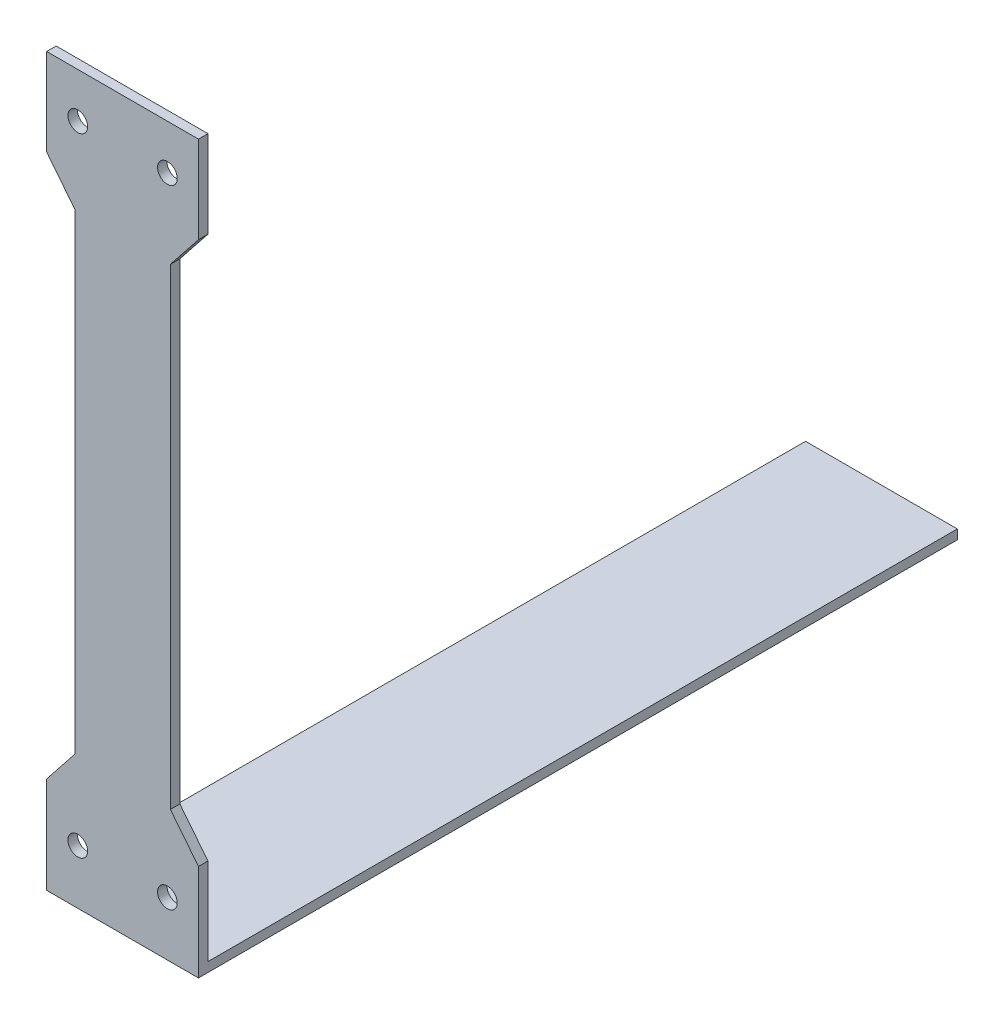
ISO-10303-21;
HEADER;
FILE_DESCRIPTION(('STEP AP214'),'2;1');
FILE_NAME('part.step','',(''),(''),'','','');
FILE_SCHEMA(('AUTOMOTIVE_DESIGN { 1 0 10303 214 1 1 1 1 }'));
ENDSEC;
DATA;
#1=APPLICATION_CONTEXT('core data for automotive mechanical design processes');
#2=APPLICATION_PROTOCOL_DEFINITION('international standard','automotive_design',2000,#1);
#3=PRODUCT_CONTEXT('',#1,'mechanical');
#4=PRODUCT('Part','Part','',(#3));
#5=PRODUCT_RELATED_PRODUCT_CATEGORY('part','',(#4));
#6=PRODUCT_DEFINITION_FORMATION('','',#4);
#7=PRODUCT_DEFINITION_CONTEXT('part definition',#1,'design');
#8=PRODUCT_DEFINITION('design','',#6,#7);
#9=PRODUCT_DEFINITION_SHAPE('','',#8);
#10=(LENGTH_UNIT() NAMED_UNIT(*) SI_UNIT(.MILLI.,.METRE.));
#11=(NAMED_UNIT(*) PLANE_ANGLE_UNIT() SI_UNIT($,.RADIAN.));
#12=(NAMED_UNIT(*) SI_UNIT($,.STERADIAN.) SOLID_ANGLE_UNIT());
#13=UNCERTAINTY_MEASURE_WITH_UNIT(LENGTH_MEASURE(1.E-05),#10,'distance_accuracy_value','');
#14=(GEOMETRIC_REPRESENTATION_CONTEXT(3) GLOBAL_UNCERTAINTY_ASSIGNED_CONTEXT((#13)) GLOBAL_UNIT_ASSIGNED_CONTEXT((#10,
#11,#12)) REPRESENTATION_CONTEXT('',''));
#15=CARTESIAN_POINT('',(0.,0.,0.));
#16=DIRECTION('',(0.,0.,1.));
#17=DIRECTION('',(1.,0.,0.));
#18=AXIS2_PLACEMENT_3D('',#15,#16,#17);
#19=CARTESIAN_POINT('',(-112.3,0.,1.5875));
#20=DIRECTION('',(1.,0.,0.));
#21=DIRECTION('',(0.,0.,-1.));
#22=AXIS2_PLACEMENT_3D('',#19,#20,#21);
#23=PLANE('',#22);
#24=DIRECTION('',(0.,-1.,0.));
#25=VECTOR('',#24,1.);
#26=CARTESIAN_POINT('',(-112.3,0.,0.));
#27=LINE('',#26,#25);
#28=CARTESIAN_POINT('',(-112.3,120.,0.));
#29=VERTEX_POINT('',#28);
#30=CARTESIAN_POINT('',(-112.3,105.418518518518,0.));
#31=VERTEX_POINT('',#30);
#32=EDGE_CURVE('E181',#29,#31,#27,.T.);
#33=ORIENTED_EDGE('',*,*,#32,.F.);
#34=DIRECTION('',(0.,0.,-1.));
#35=VECTOR('',#34,1.);
#36=CARTESIAN_POINT('',(-112.3,120.,1.5875));
#37=LINE('',#36,#35);
#38=CARTESIAN_POINT('',(-112.3,120.,1.5875));
#39=VERTEX_POINT('',#38);
#40=EDGE_CURVE('E11',#39,#29,#37,.T.);
#41=ORIENTED_EDGE('',*,*,#40,.F.);
#42=DIRECTION('',(0.,-1.,0.));
#43=VECTOR('',#42,1.);
#44=CARTESIAN_POINT('',(-112.3,0.,1.5875));
#45=LINE('',#44,#43);
#46=CARTESIAN_POINT('',(-112.3,105.418518518518,1.5875));
#47=VERTEX_POINT('',#46);
#48=EDGE_CURVE('E489',#39,#47,#45,.T.);
#49=ORIENTED_EDGE('',*,*,#48,.T.);
#50=DIRECTION('',(0.,0.,-1.));
#51=VECTOR('',#50,1.);
#52=CARTESIAN_POINT('',(-112.3,105.418518518518,1.5875));
#53=LINE('',#52,#51);
#54=EDGE_CURVE('E102',#47,#31,#53,.T.);
#55=ORIENTED_EDGE('',*,*,#54,.T.);
#56=EDGE_LOOP('',(#33,#41,#49,#55));
#57=FACE_BOUND('',#56,.T.);
#58=ADVANCED_FACE('F41',(#57),#23,.T.);
#59=CARTESIAN_POINT('',(0.,120.,1.5875));
#60=DIRECTION('',(0.,1.,0.));
#61=DIRECTION('',(0.,0.,1.));
#62=AXIS2_PLACEMENT_3D('',#59,#60,#61);
#63=PLANE('',#62);
#64=DIRECTION('',(1.,0.,0.));
#65=VECTOR('',#64,1.);
#66=CARTESIAN_POINT('',(0.,120.,0.));
#67=LINE('',#66,#65);
#68=CARTESIAN_POINT('',(-137.7,120.,0.));
#69=VERTEX_POINT('',#68);
#70=EDGE_CURVE('E179',#69,#29,#67,.T.);
#71=ORIENTED_EDGE('',*,*,#70,.F.);
#72=DIRECTION('',(0.,0.,-1.));
#73=VECTOR('',#72,1.);
#74=CARTESIAN_POINT('',(-137.7,120.,1.5875));
#75=LINE('',#74,#73);
#76=CARTESIAN_POINT('',(-137.7,120.,1.5875));
#77=VERTEX_POINT('',#76);
#78=EDGE_CURVE('E50',#77,#69,#75,.T.);
#79=ORIENTED_EDGE('',*,*,#78,.F.);
#80=DIRECTION('',(1.,0.,0.));
#81=VECTOR('',#80,1.);
#82=CARTESIAN_POINT('',(0.,120.,1.5875));
#83=LINE('',#82,#81);
#84=EDGE_CURVE('E491',#77,#39,#83,.T.);
#85=ORIENTED_EDGE('',*,*,#84,.T.);
#86=ORIENTED_EDGE('',*,*,#40,.T.);
#87=EDGE_LOOP('',(#71,#79,#85,#86));
#88=FACE_BOUND('',#87,.T.);
#89=ADVANCED_FACE('F180',(#88),#63,.T.);
#90=CARTESIAN_POINT('',(-137.7,0.,1.5875));
#91=DIRECTION('',(-1.,0.,0.));
#92=DIRECTION('',(0.,0.,1.));
#93=AXIS2_PLACEMENT_3D('',#90,#91,#92);
#94=PLANE('',#93);
#95=DIRECTION('',(0.,1.,0.));
#96=VECTOR('',#95,1.);
#97=CARTESIAN_POINT('',(-137.7,0.,0.));
#98=LINE('',#97,#96);
#99=CARTESIAN_POINT('',(-137.7,105.418518518518,0.));
#100=VERTEX_POINT('',#99);
#101=EDGE_CURVE('E172',#100,#69,#98,.T.);
#102=ORIENTED_EDGE('',*,*,#101,.F.);
#103=DIRECTION('',(0.,0.,-1.));
#104=VECTOR('',#103,1.);
#105=CARTESIAN_POINT('',(-137.7,105.418518518518,1.5875));
#106=LINE('',#105,#104);
#107=CARTESIAN_POINT('',(-137.7,105.418518518518,1.5875));
#108=VERTEX_POINT('',#107);
#109=EDGE_CURVE('E165',#108,#100,#106,.T.);
#110=ORIENTED_EDGE('',*,*,#109,.F.);
#111=DIRECTION('',(0.,1.,0.));
#112=VECTOR('',#111,1.);
#113=CARTESIAN_POINT('',(-137.7,0.,1.5875));
#114=LINE('',#113,#112);
#115=EDGE_CURVE('E174',#108,#77,#114,.T.);
#116=ORIENTED_EDGE('',*,*,#115,.T.);
#117=ORIENTED_EDGE('',*,*,#78,.T.);
#118=EDGE_LOOP('',(#102,#110,#116,#117));
#119=FACE_BOUND('',#118,.T.);
#120=ADVANCED_FACE('F170',(#119),#94,.T.);
#121=CARTESIAN_POINT('',(-33.1071618037136,-26.2909814323608,1.5875));
#122=DIRECTION('',(0.783110847498294,0.621882143601586,0.));
#123=DIRECTION('',(-0.621882143601586,0.783110847498294,0.));
#124=AXIS2_PLACEMENT_3D('',#121,#122,#123);
#125=PLANE('',#124);
#126=DIRECTION('',(0.621882143601586,-0.783110847498294,0.));
#127=VECTOR('',#126,1.);
#128=CARTESIAN_POINT('',(-33.1071618037136,-26.2909814323608,0.));
#129=LINE('',#128,#127);
#130=CARTESIAN_POINT('',(-133.,99.5,0.));
#131=VERTEX_POINT('',#130);
#132=EDGE_CURVE('E186',#100,#131,#129,.T.);
#133=ORIENTED_EDGE('',*,*,#132,.T.);
#134=DIRECTION('',(0.,0.,-1.));
#135=VECTOR('',#134,1.);
#136=CARTESIAN_POINT('',(-133.,99.5,1.5875));
#137=LINE('',#136,#135);
#138=CARTESIAN_POINT('',(-133.,99.5,1.5875));
#139=VERTEX_POINT('',#138);
#140=EDGE_CURVE('E162',#139,#131,#137,.T.);
#141=ORIENTED_EDGE('',*,*,#140,.F.);
#142=DIRECTION('',(0.621882143601586,-0.783110847498294,0.));
#143=VECTOR('',#142,1.);
#144=CARTESIAN_POINT('',(-33.1071618037136,-26.2909814323608,1.5875));
#145=LINE('',#144,#143);
#146=EDGE_CURVE('E494',#108,#139,#145,.T.);
#147=ORIENTED_EDGE('',*,*,#146,.F.);
#148=ORIENTED_EDGE('',*,*,#109,.T.);
#149=EDGE_LOOP('',(#133,#141,#147,#148));
#150=FACE_BOUND('',#149,.T.);
#151=ADVANCED_FACE('F296',(#150),#125,.F.);
#152=CARTESIAN_POINT('',(-133.,0.,1.5875));
#153=DIRECTION('',(1.,0.,0.));
#154=DIRECTION('',(0.,0.,-1.));
#155=AXIS2_PLACEMENT_3D('',#152,#153,#154);
#156=PLANE('',#155);
#157=DIRECTION('',(0.,-1.,0.));
#158=VECTOR('',#157,1.);
#159=CARTESIAN_POINT('',(-133.,0.,0.));
#160=LINE('',#159,#158);
#161=CARTESIAN_POINT('',(-133.,20.5,0.));
#162=VERTEX_POINT('',#161);
#163=EDGE_CURVE('E188',#131,#162,#160,.T.);
#164=ORIENTED_EDGE('',*,*,#163,.T.);
#165=DIRECTION('',(0.,0.,-1.));
#166=VECTOR('',#165,1.);
#167=CARTESIAN_POINT('',(-133.,20.5,1.5875));
#168=LINE('',#167,#166);
#169=CARTESIAN_POINT('',(-133.,20.5,1.5875));
#170=VERTEX_POINT('',#169);
#171=EDGE_CURVE('E159',#170,#162,#168,.T.);
#172=ORIENTED_EDGE('',*,*,#171,.F.);
#173=DIRECTION('',(0.,-1.,0.));
#174=VECTOR('',#173,1.);
#175=CARTESIAN_POINT('',(-133.,0.,1.5875));
#176=LINE('',#175,#174);
#177=EDGE_CURVE('E497',#139,#170,#176,.T.);
#178=ORIENTED_EDGE('',*,*,#177,.F.);
#179=ORIENTED_EDGE('',*,*,#140,.T.);
#180=EDGE_LOOP('',(#164,#172,#178,#179));
#181=FACE_BOUND('',#180,.T.);
#182=ADVANCED_FACE('F292',(#181),#156,.F.);
#183=CARTESIAN_POINT('',(-91.5474801061009,72.6994694960212,1.5875));
#184=DIRECTION('',(0.783110847498294,-0.621882143601586,0.));
#185=DIRECTION('',(0.621882143601586,0.783110847498294,0.));
#186=AXIS2_PLACEMENT_3D('',#183,#184,#185);
#187=PLANE('',#186);
#188=DIRECTION('',(-0.621882143601586,-0.783110847498294,0.));
#189=VECTOR('',#188,1.);
#190=CARTESIAN_POINT('',(-91.5474801061009,72.6994694960212,0.));
#191=LINE('',#190,#189);
#192=CARTESIAN_POINT('',(-137.7,14.5814814814815,0.));
#193=VERTEX_POINT('',#192);
#194=EDGE_CURVE('E194',#162,#193,#191,.T.);
#195=ORIENTED_EDGE('',*,*,#194,.T.);
#196=DIRECTION('',(0.,0.,-1.));
#197=VECTOR('',#196,1.);
#198=CARTESIAN_POINT('',(-137.7,14.5814814814815,1.5875));
#199=LINE('',#198,#197);
#200=CARTESIAN_POINT('',(-137.7,14.5814814814815,1.5875));
#201=VERTEX_POINT('',#200);
#202=EDGE_CURVE('E152',#201,#193,#199,.T.);
#203=ORIENTED_EDGE('',*,*,#202,.F.);
#204=DIRECTION('',(-0.621882143601586,-0.783110847498294,0.));
#205=VECTOR('',#204,1.);
#206=CARTESIAN_POINT('',(-91.5474801061009,72.6994694960212,1.5875));
#207=LINE('',#206,#205);
#208=EDGE_CURVE('E500',#170,#201,#207,.T.);
#209=ORIENTED_EDGE('',*,*,#208,.F.);
#210=ORIENTED_EDGE('',*,*,#171,.T.);
#211=EDGE_LOOP('',(#195,#203,#209,#210));
#212=FACE_BOUND('',#211,.T.);
#213=ADVANCED_FACE('F288',(#212),#187,.F.);
#214=CARTESIAN_POINT('',(-137.7,0.,1.5875));
#215=DIRECTION('',(1.,0.,0.));
#216=DIRECTION('',(0.,0.,-1.));
#217=AXIS2_PLACEMENT_3D('',#214,#215,#216);
#218=PLANE('',#217);
#219=DIRECTION('',(0.,-1.,0.));
#220=VECTOR('',#219,1.);
#221=CARTESIAN_POINT('',(-137.7,0.,0.));
#222=LINE('',#221,#220);
#223=CARTESIAN_POINT('',(-137.7,0.,0.));
#224=VERTEX_POINT('',#223);
#225=EDGE_CURVE('E197',#193,#224,#222,.T.);
#226=ORIENTED_EDGE('',*,*,#225,.T.);
#227=DIRECTION('',(0.,0.,1.));
#228=VECTOR('',#227,1.);
#229=CARTESIAN_POINT('',(-137.7,0.,-125.4125));
#230=LINE('',#229,#228);
#231=CARTESIAN_POINT('',(-137.7,0.,-125.4125));
#232=VERTEX_POINT('',#231);
#233=EDGE_CURVE('E456',#232,#224,#230,.T.);
#234=ORIENTED_EDGE('',*,*,#233,.F.);
#235=DIRECTION('',(0.,1.,0.));
#236=VECTOR('',#235,1.);
#237=CARTESIAN_POINT('',(-137.7,-1.5875,-125.4125));
#238=LINE('',#237,#236);
#239=CARTESIAN_POINT('',(-137.7,-1.5875,-125.4125));
#240=VERTEX_POINT('',#239);
#241=EDGE_CURVE('E216',#240,#232,#238,.T.);
#242=ORIENTED_EDGE('',*,*,#241,.F.);
#243=DIRECTION('',(0.,0.,1.));
#244=VECTOR('',#243,1.);
#245=CARTESIAN_POINT('',(-137.7,-1.5875,-125.4125));
#246=LINE('',#245,#244);
#247=CARTESIAN_POINT('',(-137.7,-1.5875,1.5875));
#248=VERTEX_POINT('',#247);
#249=EDGE_CURVE('E450',#240,#248,#246,.T.);
#250=ORIENTED_EDGE('',*,*,#249,.T.);
#251=DIRECTION('',(0.,-1.,0.));
#252=VECTOR('',#251,1.);
#253=CARTESIAN_POINT('',(-137.7,0.,1.5875));
#254=LINE('',#253,#252);
#255=EDGE_CURVE('E459',#201,#248,#254,.T.);
#256=ORIENTED_EDGE('',*,*,#255,.F.);
#257=ORIENTED_EDGE('',*,*,#202,.T.);
#258=EDGE_LOOP('',(#226,#234,#242,#250,#256,#257));
#259=FACE_BOUND('',#258,.T.);
#260=ADVANCED_FACE('F284',(#259),#218,.F.);
#261=CARTESIAN_POINT('',(-112.3,0.,1.5875));
#262=DIRECTION('',(1.,0.,0.));
#263=DIRECTION('',(0.,0.,-1.));
#264=AXIS2_PLACEMENT_3D('',#261,#262,#263);
#265=PLANE('',#264);
#266=DIRECTION('',(0.,-1.,0.));
#267=VECTOR('',#266,1.);
#268=CARTESIAN_POINT('',(-112.3,0.,0.));
#269=LINE('',#268,#267);
#270=CARTESIAN_POINT('',(-112.3,14.5814814814814,0.));
#271=VERTEX_POINT('',#270);
#272=CARTESIAN_POINT('',(-112.3,0.,0.));
#273=VERTEX_POINT('',#272);
#274=EDGE_CURVE('E203',#271,#273,#269,.T.);
#275=ORIENTED_EDGE('',*,*,#274,.F.);
#276=DIRECTION('',(0.,0.,-1.));
#277=VECTOR('',#276,1.);
#278=CARTESIAN_POINT('',(-112.3,14.5814814814814,1.5875));
#279=LINE('',#278,#277);
#280=CARTESIAN_POINT('',(-112.3,14.5814814814814,1.5875));
#281=VERTEX_POINT('',#280);
#282=EDGE_CURVE('E150',#281,#271,#279,.T.);
#283=ORIENTED_EDGE('',*,*,#282,.F.);
#284=DIRECTION('',(0.,-1.,0.));
#285=VECTOR('',#284,1.);
#286=CARTESIAN_POINT('',(-112.3,0.,1.5875));
#287=LINE('',#286,#285);
#288=CARTESIAN_POINT('',(-112.3,-1.5875,1.5875));
#289=VERTEX_POINT('',#288);
#290=EDGE_CURVE('E144',#281,#289,#287,.T.);
#291=ORIENTED_EDGE('',*,*,#290,.T.);
#292=DIRECTION('',(0.,0.,-1.));
#293=VECTOR('',#292,1.);
#294=CARTESIAN_POINT('',(-112.3,-1.5875,1.5875));
#295=LINE('',#294,#293);
#296=CARTESIAN_POINT('',(-112.3,-1.5875,-125.4125));
#297=VERTEX_POINT('',#296);
#298=EDGE_CURVE('E453',#289,#297,#295,.T.);
#299=ORIENTED_EDGE('',*,*,#298,.T.);
#300=DIRECTION('',(0.,1.,0.));
#301=VECTOR('',#300,1.);
#302=CARTESIAN_POINT('',(-112.3,-1.5875,-125.4125));
#303=LINE('',#302,#301);
#304=CARTESIAN_POINT('',(-112.3,0.,-125.4125));
#305=VERTEX_POINT('',#304);
#306=EDGE_CURVE('E464',#297,#305,#303,.T.);
#307=ORIENTED_EDGE('',*,*,#306,.T.);
#308=DIRECTION('',(0.,0.,-1.));
#309=VECTOR('',#308,1.);
#310=CARTESIAN_POINT('',(-112.3,0.,1.5875));
#311=LINE('',#310,#309);
#312=EDGE_CURVE('E472',#273,#305,#311,.T.);
#313=ORIENTED_EDGE('',*,*,#312,.F.);
#314=EDGE_LOOP('',(#275,#283,#291,#299,#307,#313));
#315=FACE_BOUND('',#314,.T.);
#316=ADVANCED_FACE('F281',(#315),#265,.T.);
#317=CARTESIAN_POINT('',(-61.7681697612732,-49.0511936339523,1.5875));
#318=DIRECTION('',(-0.783110847498294,-0.621882143601587,0.));
#319=DIRECTION('',(0.621882143601587,-0.783110847498294,0.));
#320=AXIS2_PLACEMENT_3D('',#317,#318,#319);
#321=PLANE('',#320);
#322=DIRECTION('',(-0.621882143601587,0.783110847498294,0.));
#323=VECTOR('',#322,1.);
#324=CARTESIAN_POINT('',(-61.7681697612732,-49.0511936339523,0.));
#325=LINE('',#324,#323);
#326=CARTESIAN_POINT('',(-117.,20.5,0.));
#327=VERTEX_POINT('',#326);
#328=EDGE_CURVE('E149',#271,#327,#325,.T.);
#329=ORIENTED_EDGE('',*,*,#328,.T.);
#330=DIRECTION('',(0.,0.,-1.));
#331=VECTOR('',#330,1.);
#332=CARTESIAN_POINT('',(-117.,20.5,1.5875));
#333=LINE('',#332,#331);
#334=CARTESIAN_POINT('',(-117.,20.5,1.5875));
#335=VERTEX_POINT('',#334);
#336=EDGE_CURVE('E134',#335,#327,#333,.T.);
#337=ORIENTED_EDGE('',*,*,#336,.F.);
#338=DIRECTION('',(-0.621882143601587,0.783110847498294,0.));
#339=VECTOR('',#338,1.);
#340=CARTESIAN_POINT('',(-61.7681697612732,-49.0511936339523,1.5875));
#341=LINE('',#340,#339);
#342=EDGE_CURVE('E137',#281,#335,#341,.T.);
#343=ORIENTED_EDGE('',*,*,#342,.F.);
#344=ORIENTED_EDGE('',*,*,#282,.T.);
#345=EDGE_LOOP('',(#329,#337,#343,#344));
#346=FACE_BOUND('',#345,.T.);
#347=ADVANCED_FACE('F147',(#346),#321,.F.);
#348=CARTESIAN_POINT('',(-117.,0.,1.5875));
#349=DIRECTION('',(-1.,0.,0.));
#350=DIRECTION('',(0.,0.,1.));
#351=AXIS2_PLACEMENT_3D('',#348,#349,#350);
#352=PLANE('',#351);
#353=DIRECTION('',(0.,1.,0.));
#354=VECTOR('',#353,1.);
#355=CARTESIAN_POINT('',(-117.,0.,0.));
#356=LINE('',#355,#354);
#357=CARTESIAN_POINT('',(-117.,99.5,0.));
#358=VERTEX_POINT('',#357);
#359=EDGE_CURVE('E207',#327,#358,#356,.T.);
#360=ORIENTED_EDGE('',*,*,#359,.T.);
#361=DIRECTION('',(0.,0.,-1.));
#362=VECTOR('',#361,1.);
#363=CARTESIAN_POINT('',(-117.,99.5,1.5875));
#364=LINE('',#363,#362);
#365=CARTESIAN_POINT('',(-117.,99.5,1.5875));
#366=VERTEX_POINT('',#365);
#367=EDGE_CURVE('E136',#366,#358,#364,.T.);
#368=ORIENTED_EDGE('',*,*,#367,.F.);
#369=DIRECTION('',(0.,1.,0.));
#370=VECTOR('',#369,1.);
#371=CARTESIAN_POINT('',(-117.,0.,1.5875));
#372=LINE('',#371,#370);
#373=EDGE_CURVE('E129',#335,#366,#372,.T.);
#374=ORIENTED_EDGE('',*,*,#373,.F.);
#375=ORIENTED_EDGE('',*,*,#336,.T.);
#376=EDGE_LOOP('',(#360,#368,#374,#375));
#377=FACE_BOUND('',#376,.T.);
#378=ADVANCED_FACE('F132',(#377),#352,.F.);
#379=CARTESIAN_POINT('',(-132.5,112.5,1.5875));
#380=DIRECTION('',(0.,0.,-1.));
#381=DIRECTION('',(-1.,0.,0.));
#382=AXIS2_PLACEMENT_3D('',#379,#380,#381);
#383=CYLINDRICAL_SURFACE('',#382,1.65);
#384=CARTESIAN_POINT('',(-132.5,112.5,1.5875));
#385=DIRECTION('',(0.,0.,1.));
#386=DIRECTION('',(1.,0.,0.));
#387=AXIS2_PLACEMENT_3D('',#384,#385,#386);
#388=CIRCLE('',#387,1.65);
#389=CARTESIAN_POINT('',(-130.85,112.5,1.5875));
#390=VERTEX_POINT('',#389);
#391=EDGE_CURVE('E486',#390,#390,#388,.T.);
#392=ORIENTED_EDGE('',*,*,#391,.T.);
#393=EDGE_LOOP('',(#392));
#394=FACE_BOUND('',#393,.T.);
#395=CARTESIAN_POINT('',(-132.5,112.5,0.));
#396=DIRECTION('',(0.,0.,1.));
#397=DIRECTION('',(1.,0.,0.));
#398=AXIS2_PLACEMENT_3D('',#395,#396,#397);
#399=CIRCLE('',#398,1.65);
#400=CARTESIAN_POINT('',(-130.85,112.5,0.));
#401=VERTEX_POINT('',#400);
#402=EDGE_CURVE('E222',#401,#401,#399,.T.);
#403=ORIENTED_EDGE('',*,*,#402,.F.);
#404=EDGE_LOOP('',(#403));
#405=FACE_BOUND('',#404,.T.);
#406=ADVANCED_FACE('F232',(#394,#405),#383,.F.);
#407=CARTESIAN_POINT('',(-117.5,112.5,1.5875));
#408=DIRECTION('',(0.,0.,-1.));
#409=DIRECTION('',(-1.,0.,0.));
#410=AXIS2_PLACEMENT_3D('',#407,#408,#409);
#411=CYLINDRICAL_SURFACE('',#410,1.65000000000001);
#412=CARTESIAN_POINT('',(-117.5,112.5,1.5875));
#413=DIRECTION('',(0.,0.,1.));
#414=DIRECTION('',(1.,0.,0.));
#415=AXIS2_PLACEMENT_3D('',#412,#413,#414);
#416=CIRCLE('',#415,1.65000000000001);
#417=CARTESIAN_POINT('',(-115.85,112.5,1.5875));
#418=VERTEX_POINT('',#417);
#419=EDGE_CURVE('E483',#418,#418,#416,.T.);
#420=ORIENTED_EDGE('',*,*,#419,.T.);
#421=EDGE_LOOP('',(#420));
#422=FACE_BOUND('',#421,.T.);
#423=CARTESIAN_POINT('',(-117.5,112.5,0.));
#424=DIRECTION('',(0.,0.,1.));
#425=DIRECTION('',(1.,0.,0.));
#426=AXIS2_PLACEMENT_3D('',#423,#424,#425);
#427=CIRCLE('',#426,1.65000000000001);
#428=CARTESIAN_POINT('',(-115.85,112.5,0.));
#429=VERTEX_POINT('',#428);
#430=EDGE_CURVE('E219',#429,#429,#427,.T.);
#431=ORIENTED_EDGE('',*,*,#430,.F.);
#432=EDGE_LOOP('',(#431));
#433=FACE_BOUND('',#432,.T.);
#434=ADVANCED_FACE('F235',(#422,#433),#411,.F.);
#435=CARTESIAN_POINT('',(-117.5,7.5,1.5875));
#436=DIRECTION('',(0.,0.,-1.));
#437=DIRECTION('',(-1.,0.,0.));
#438=AXIS2_PLACEMENT_3D('',#435,#436,#437);
#439=CYLINDRICAL_SURFACE('',#438,1.65000000000001);
#440=CARTESIAN_POINT('',(-117.5,7.5,1.5875));
#441=DIRECTION('',(0.,0.,1.));
#442=DIRECTION('',(1.,0.,0.));
#443=AXIS2_PLACEMENT_3D('',#440,#441,#442);
#444=CIRCLE('',#443,1.65000000000001);
#445=CARTESIAN_POINT('',(-115.85,7.5,1.5875));
#446=VERTEX_POINT('',#445);
#447=EDGE_CURVE('E250',#446,#446,#444,.T.);
#448=ORIENTED_EDGE('',*,*,#447,.T.);
#449=EDGE_LOOP('',(#448));
#450=FACE_BOUND('',#449,.T.);
#451=CARTESIAN_POINT('',(-117.5,7.5,0.));
#452=DIRECTION('',(0.,0.,1.));
#453=DIRECTION('',(1.,0.,0.));
#454=AXIS2_PLACEMENT_3D('',#451,#452,#453);
#455=CIRCLE('',#454,1.65000000000001);
#456=CARTESIAN_POINT('',(-115.85,7.5,0.));
#457=VERTEX_POINT('',#456);
#458=EDGE_CURVE('E215',#457,#457,#455,.T.);
#459=ORIENTED_EDGE('',*,*,#458,.F.);
#460=EDGE_LOOP('',(#459));
#461=FACE_BOUND('',#460,.T.);
#462=ADVANCED_FACE('F238',(#450,#461),#439,.F.);
#463=CARTESIAN_POINT('',(-132.5,7.5,1.5875));
#464=DIRECTION('',(0.,0.,-1.));
#465=DIRECTION('',(-1.,0.,0.));
#466=AXIS2_PLACEMENT_3D('',#463,#464,#465);
#467=CYLINDRICAL_SURFACE('',#466,1.65);
#468=CARTESIAN_POINT('',(-132.5,7.5,1.5875));
#469=DIRECTION('',(0.,0.,1.));
#470=DIRECTION('',(1.,0.,0.));
#471=AXIS2_PLACEMENT_3D('',#468,#469,#470);
#472=CIRCLE('',#471,1.65);
#473=CARTESIAN_POINT('',(-130.85,7.5,1.5875));
#474=VERTEX_POINT('',#473);
#475=EDGE_CURVE('E209',#474,#474,#472,.T.);
#476=ORIENTED_EDGE('',*,*,#475,.T.);
#477=EDGE_LOOP('',(#476));
#478=FACE_BOUND('',#477,.T.);
#479=CARTESIAN_POINT('',(-132.5,7.5,0.));
#480=DIRECTION('',(0.,0.,1.));
#481=DIRECTION('',(1.,0.,0.));
#482=AXIS2_PLACEMENT_3D('',#479,#480,#481);
#483=CIRCLE('',#482,1.65);
#484=CARTESIAN_POINT('',(-130.85,7.5,0.));
#485=VERTEX_POINT('',#484);
#486=EDGE_CURVE('E212',#485,#485,#483,.T.);
#487=ORIENTED_EDGE('',*,*,#486,.F.);
#488=EDGE_LOOP('',(#487));
#489=FACE_BOUND('',#488,.T.);
#490=ADVANCED_FACE('F43',(#478,#489),#467,.F.);
#491=CARTESIAN_POINT('',(-120.20848806366,95.4596816976128,1.5875));
#492=DIRECTION('',(-0.783110847498294,0.621882143601587,0.));
#493=DIRECTION('',(-0.621882143601587,-0.783110847498294,0.));
#494=AXIS2_PLACEMENT_3D('',#491,#492,#493);
#495=PLANE('',#494);
#496=DIRECTION('',(0.621882143601587,0.783110847498294,0.));
#497=VECTOR('',#496,1.);
#498=CARTESIAN_POINT('',(-120.20848806366,95.4596816976128,0.));
#499=LINE('',#498,#497);
#500=EDGE_CURVE('E95',#358,#31,#499,.T.);
#501=ORIENTED_EDGE('',*,*,#500,.T.);
#502=ORIENTED_EDGE('',*,*,#54,.F.);
#503=DIRECTION('',(0.621882143601587,0.783110847498294,0.));
#504=VECTOR('',#503,1.);
#505=CARTESIAN_POINT('',(-120.20848806366,95.4596816976128,1.5875));
#506=LINE('',#505,#504);
#507=EDGE_CURVE('E58',#366,#47,#506,.T.);
#508=ORIENTED_EDGE('',*,*,#507,.F.);
#509=ORIENTED_EDGE('',*,*,#367,.T.);
#510=EDGE_LOOP('',(#501,#502,#508,#509));
#511=FACE_BOUND('',#510,.T.);
#512=ADVANCED_FACE('F245',(#511),#495,.F.);
#513=CARTESIAN_POINT('',(0.,0.,1.5875));
#514=DIRECTION('',(0.,0.,1.));
#515=DIRECTION('',(1.,0.,0.));
#516=AXIS2_PLACEMENT_3D('',#513,#514,#515);
#517=PLANE('',#516);
#518=ORIENTED_EDGE('',*,*,#475,.F.);
#519=EDGE_LOOP('',(#518));
#520=FACE_BOUND('',#519,.T.);
#521=ORIENTED_EDGE('',*,*,#447,.F.);
#522=EDGE_LOOP('',(#521));
#523=FACE_BOUND('',#522,.T.);
#524=ORIENTED_EDGE('',*,*,#419,.F.);
#525=EDGE_LOOP('',(#524));
#526=FACE_BOUND('',#525,.T.);
#527=ORIENTED_EDGE('',*,*,#391,.F.);
#528=EDGE_LOOP('',(#527));
#529=FACE_BOUND('',#528,.T.);
#530=ORIENTED_EDGE('',*,*,#48,.F.);
#531=ORIENTED_EDGE('',*,*,#84,.F.);
#532=ORIENTED_EDGE('',*,*,#115,.F.);
#533=ORIENTED_EDGE('',*,*,#146,.T.);
#534=ORIENTED_EDGE('',*,*,#177,.T.);
#535=ORIENTED_EDGE('',*,*,#208,.T.);
#536=ORIENTED_EDGE('',*,*,#255,.T.);
#537=DIRECTION('',(1.,0.,0.));
#538=VECTOR('',#537,1.);
#539=CARTESIAN_POINT('',(-137.7,-1.5875,1.5875));
#540=LINE('',#539,#538);
#541=EDGE_CURVE('E446',#248,#289,#540,.T.);
#542=ORIENTED_EDGE('',*,*,#541,.T.);
#543=ORIENTED_EDGE('',*,*,#290,.F.);
#544=ORIENTED_EDGE('',*,*,#342,.T.);
#545=ORIENTED_EDGE('',*,*,#373,.T.);
#546=ORIENTED_EDGE('',*,*,#507,.T.);
#547=EDGE_LOOP('',(#530,#531,#532,#533,#534,#535,#536,#542,#543,#544,#545,#546));
#548=FACE_BOUND('',#547,.T.);
#549=ADVANCED_FACE('F141',(#520,#523,#526,#529,#548),#517,.T.);
#550=CARTESIAN_POINT('',(0.,0.,0.));
#551=DIRECTION('',(0.,0.,1.));
#552=DIRECTION('',(1.,0.,0.));
#553=AXIS2_PLACEMENT_3D('',#550,#551,#552);
#554=PLANE('',#553);
#555=ORIENTED_EDGE('',*,*,#486,.T.);
#556=EDGE_LOOP('',(#555));
#557=FACE_BOUND('',#556,.T.);
#558=ORIENTED_EDGE('',*,*,#458,.T.);
#559=EDGE_LOOP('',(#558));
#560=FACE_BOUND('',#559,.T.);
#561=ORIENTED_EDGE('',*,*,#430,.T.);
#562=EDGE_LOOP('',(#561));
#563=FACE_BOUND('',#562,.T.);
#564=ORIENTED_EDGE('',*,*,#402,.T.);
#565=EDGE_LOOP('',(#564));
#566=FACE_BOUND('',#565,.T.);
#567=ORIENTED_EDGE('',*,*,#32,.T.);
#568=ORIENTED_EDGE('',*,*,#500,.F.);
#569=ORIENTED_EDGE('',*,*,#359,.F.);
#570=ORIENTED_EDGE('',*,*,#328,.F.);
#571=ORIENTED_EDGE('',*,*,#274,.T.);
#572=DIRECTION('',(-1.,0.,0.));
#573=VECTOR('',#572,1.);
#574=CARTESIAN_POINT('',(0.,0.,0.));
#575=LINE('',#574,#573);
#576=EDGE_CURVE('E200',#273,#224,#575,.T.);
#577=ORIENTED_EDGE('',*,*,#576,.T.);
#578=ORIENTED_EDGE('',*,*,#225,.F.);
#579=ORIENTED_EDGE('',*,*,#194,.F.);
#580=ORIENTED_EDGE('',*,*,#163,.F.);
#581=ORIENTED_EDGE('',*,*,#132,.F.);
#582=ORIENTED_EDGE('',*,*,#101,.T.);
#583=ORIENTED_EDGE('',*,*,#70,.T.);
#584=EDGE_LOOP('',(#567,#568,#569,#570,#571,#577,#578,#579,#580,#581,#582,#583));
#585=FACE_BOUND('',#584,.T.);
#586=ADVANCED_FACE('F184',(#557,#560,#563,#566,#585),#554,.F.);
#587=CARTESIAN_POINT('',(0.,0.,0.));
#588=DIRECTION('',(0.,1.,0.));
#589=DIRECTION('',(0.,0.,1.));
#590=AXIS2_PLACEMENT_3D('',#587,#588,#589);
#591=PLANE('',#590);
#592=ORIENTED_EDGE('',*,*,#576,.F.);
#593=ORIENTED_EDGE('',*,*,#312,.T.);
#594=DIRECTION('',(-1.,0.,0.));
#595=VECTOR('',#594,1.);
#596=CARTESIAN_POINT('',(-112.3,0.,-125.4125));
#597=LINE('',#596,#595);
#598=EDGE_CURVE('E475',#305,#232,#597,.T.);
#599=ORIENTED_EDGE('',*,*,#598,.T.);
#600=ORIENTED_EDGE('',*,*,#233,.T.);
#601=EDGE_LOOP('',(#592,#593,#599,#600));
#602=FACE_BOUND('',#601,.T.);
#603=ADVANCED_FACE('F255',(#602),#591,.T.);
#604=CARTESIAN_POINT('',(-112.3,-1.5875,-125.4125));
#605=DIRECTION('',(0.,0.,-1.));
#606=DIRECTION('',(-1.,0.,0.));
#607=AXIS2_PLACEMENT_3D('',#604,#605,#606);
#608=PLANE('',#607);
#609=ORIENTED_EDGE('',*,*,#598,.F.);
#610=ORIENTED_EDGE('',*,*,#306,.F.);
#611=DIRECTION('',(-1.,0.,0.));
#612=VECTOR('',#611,1.);
#613=CARTESIAN_POINT('',(-112.3,-1.5875,-125.4125));
#614=LINE('',#613,#612);
#615=EDGE_CURVE('E465',#297,#240,#614,.T.);
#616=ORIENTED_EDGE('',*,*,#615,.T.);
#617=ORIENTED_EDGE('',*,*,#241,.T.);
#618=EDGE_LOOP('',(#609,#610,#616,#617));
#619=FACE_BOUND('',#618,.T.);
#620=ADVANCED_FACE('F267',(#619),#608,.T.);
#621=CARTESIAN_POINT('',(0.,-1.5875,0.));
#622=DIRECTION('',(0.,1.,0.));
#623=DIRECTION('',(0.,0.,1.));
#624=AXIS2_PLACEMENT_3D('',#621,#622,#623);
#625=PLANE('',#624);
#626=ORIENTED_EDGE('',*,*,#541,.F.);
#627=ORIENTED_EDGE('',*,*,#249,.F.);
#628=ORIENTED_EDGE('',*,*,#615,.F.);
#629=ORIENTED_EDGE('',*,*,#298,.F.);
#630=EDGE_LOOP('',(#626,#627,#628,#629));
#631=FACE_BOUND('',#630,.T.);
#632=ADVANCED_FACE('F428',(#631),#625,.F.);
#633=CLOSED_SHELL('',(#58,#89,#120,#151,#182,#213,#260,#316,#347,#378,#406,#434,#462,#490,#512,
#549,#586,#603,#620,#632));
#634=MANIFOLD_SOLID_BREP('B2',#633);
#635=ADVANCED_BREP_SHAPE_REPRESENTATION('',(#18,#634),#14);
#636=SHAPE_DEFINITION_REPRESENTATION(#9,#635);
ENDSEC;
END-ISO-10303-21;
